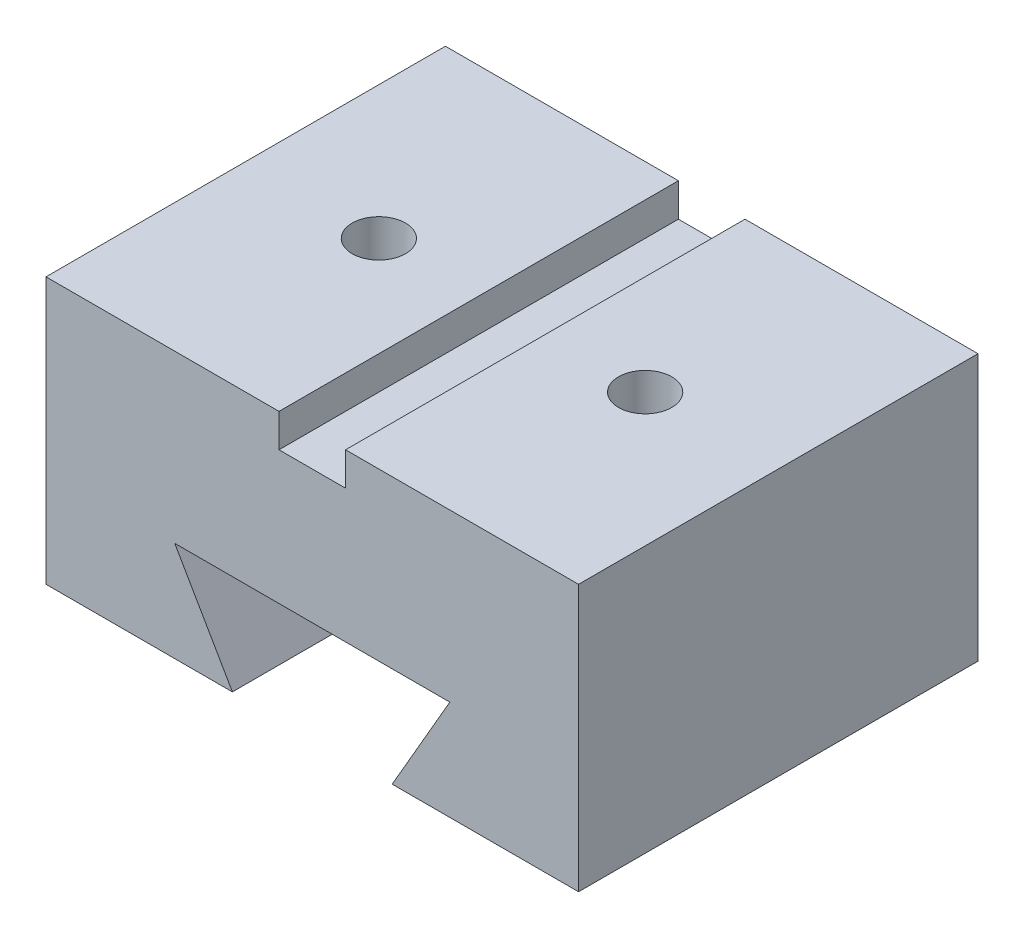
ISO-10303-21;
HEADER;
FILE_DESCRIPTION(('STEP AP214'),'2;1');
FILE_NAME('part.step','',(''),(''),'','','');
FILE_SCHEMA(('AUTOMOTIVE_DESIGN { 1 0 10303 214 1 1 1 1 }'));
ENDSEC;
DATA;
#1=APPLICATION_CONTEXT('core data for automotive mechanical design processes');
#2=APPLICATION_PROTOCOL_DEFINITION('international standard','automotive_design',2000,#1);
#3=PRODUCT_CONTEXT('',#1,'mechanical');
#4=PRODUCT('Part','Part','',(#3));
#5=PRODUCT_RELATED_PRODUCT_CATEGORY('part','',(#4));
#6=PRODUCT_DEFINITION_FORMATION('','',#4);
#7=PRODUCT_DEFINITION_CONTEXT('part definition',#1,'design');
#8=PRODUCT_DEFINITION('design','',#6,#7);
#9=PRODUCT_DEFINITION_SHAPE('','',#8);
#10=(LENGTH_UNIT() NAMED_UNIT(*) SI_UNIT(.MILLI.,.METRE.));
#11=(NAMED_UNIT(*) PLANE_ANGLE_UNIT() SI_UNIT($,.RADIAN.));
#12=(NAMED_UNIT(*) SI_UNIT($,.STERADIAN.) SOLID_ANGLE_UNIT());
#13=UNCERTAINTY_MEASURE_WITH_UNIT(LENGTH_MEASURE(1.E-05),#10,'distance_accuracy_value','');
#14=(GEOMETRIC_REPRESENTATION_CONTEXT(3) GLOBAL_UNCERTAINTY_ASSIGNED_CONTEXT((#13)) GLOBAL_UNIT_ASSIGNED_CONTEXT((#10,
#11,#12)) REPRESENTATION_CONTEXT('',''));
#15=CARTESIAN_POINT('',(0.,0.,0.));
#16=DIRECTION('',(0.,0.,1.));
#17=DIRECTION('',(1.,0.,0.));
#18=AXIS2_PLACEMENT_3D('',#15,#16,#17);
#19=CARTESIAN_POINT('',(0.,40.,0.));
#20=DIRECTION('',(0.,-1.,0.));
#21=DIRECTION('',(0.,0.,-1.));
#22=AXIS2_PLACEMENT_3D('',#19,#20,#21);
#23=PLANE('',#22);
#24=CARTESIAN_POINT('',(-20.,40.,0.));
#25=DIRECTION('',(0.,1.,0.));
#26=DIRECTION('',(0.,0.,1.));
#27=AXIS2_PLACEMENT_3D('',#24,#25,#26);
#28=CIRCLE('',#27,4.);
#29=CARTESIAN_POINT('',(-20.,40.,4.));
#30=VERTEX_POINT('',#29);
#31=EDGE_CURVE('E280',#30,#30,#28,.T.);
#32=ORIENTED_EDGE('',*,*,#31,.F.);
#33=EDGE_LOOP('',(#32));
#34=FACE_BOUND('',#33,.T.);
#35=DIRECTION('',(1.,0.,0.));
#36=VECTOR('',#35,1.);
#37=CARTESIAN_POINT('',(40.,40.,30.));
#38=LINE('',#37,#36);
#39=CARTESIAN_POINT('',(-40.,40.,30.));
#40=VERTEX_POINT('',#39);
#41=CARTESIAN_POINT('',(-5.,40.,30.));
#42=VERTEX_POINT('',#41);
#43=EDGE_CURVE('E99',#40,#42,#38,.T.);
#44=ORIENTED_EDGE('',*,*,#43,.T.);
#45=DIRECTION('',(0.,0.,1.));
#46=VECTOR('',#45,1.);
#47=CARTESIAN_POINT('',(-5.,40.,30.));
#48=LINE('',#47,#46);
#49=CARTESIAN_POINT('',(-5.,40.,-30.));
#50=VERTEX_POINT('',#49);
#51=EDGE_CURVE('E149',#50,#42,#48,.T.);
#52=ORIENTED_EDGE('',*,*,#51,.F.);
#53=DIRECTION('',(-1.,0.,0.));
#54=VECTOR('',#53,1.);
#55=CARTESIAN_POINT('',(-40.,40.,-30.));
#56=LINE('',#55,#54);
#57=CARTESIAN_POINT('',(-40.,40.,-30.));
#58=VERTEX_POINT('',#57);
#59=EDGE_CURVE('E70',#50,#58,#56,.T.);
#60=ORIENTED_EDGE('',*,*,#59,.T.);
#61=DIRECTION('',(0.,0.,1.));
#62=VECTOR('',#61,1.);
#63=CARTESIAN_POINT('',(-40.,40.,30.));
#64=LINE('',#63,#62);
#65=EDGE_CURVE('E223',#58,#40,#64,.T.);
#66=ORIENTED_EDGE('',*,*,#65,.T.);
#67=EDGE_LOOP('',(#44,#52,#60,#66));
#68=FACE_BOUND('',#67,.T.);
#69=ADVANCED_FACE('F45',(#34,#68),#23,.F.);
#70=CARTESIAN_POINT('',(0.,0.,0.));
#71=DIRECTION('',(0.,-1.,0.));
#72=DIRECTION('',(0.,0.,-1.));
#73=AXIS2_PLACEMENT_3D('',#70,#71,#72);
#74=PLANE('',#73);
#75=DIRECTION('',(-1.,0.,0.));
#76=VECTOR('',#75,1.);
#77=CARTESIAN_POINT('',(-40.,0.,-30.));
#78=LINE('',#77,#76);
#79=CARTESIAN_POINT('',(-12.,0.,-30.));
#80=VERTEX_POINT('',#79);
#81=CARTESIAN_POINT('',(-40.,0.,-30.));
#82=VERTEX_POINT('',#81);
#83=EDGE_CURVE('E92',#80,#82,#78,.T.);
#84=ORIENTED_EDGE('',*,*,#83,.F.);
#85=DIRECTION('',(0.,0.,-1.));
#86=VECTOR('',#85,1.);
#87=CARTESIAN_POINT('',(-12.,0.,30.));
#88=LINE('',#87,#86);
#89=CARTESIAN_POINT('',(-12.,0.,30.));
#90=VERTEX_POINT('',#89);
#91=EDGE_CURVE('E219',#90,#80,#88,.T.);
#92=ORIENTED_EDGE('',*,*,#91,.F.);
#93=DIRECTION('',(1.,0.,0.));
#94=VECTOR('',#93,1.);
#95=CARTESIAN_POINT('',(40.,0.,30.));
#96=LINE('',#95,#94);
#97=CARTESIAN_POINT('',(-40.,0.,30.));
#98=VERTEX_POINT('',#97);
#99=EDGE_CURVE('E241',#98,#90,#96,.T.);
#100=ORIENTED_EDGE('',*,*,#99,.F.);
#101=DIRECTION('',(0.,0.,1.));
#102=VECTOR('',#101,1.);
#103=CARTESIAN_POINT('',(-40.,0.,30.));
#104=LINE('',#103,#102);
#105=EDGE_CURVE('E222',#82,#98,#104,.T.);
#106=ORIENTED_EDGE('',*,*,#105,.F.);
#107=EDGE_LOOP('',(#84,#92,#100,#106));
#108=FACE_BOUND('',#107,.T.);
#109=ADVANCED_FACE('F302',(#108),#74,.T.);
#110=CARTESIAN_POINT('',(40.,40.,30.));
#111=DIRECTION('',(0.,0.,-1.));
#112=DIRECTION('',(-1.,0.,0.));
#113=AXIS2_PLACEMENT_3D('',#110,#111,#112);
#114=PLANE('',#113);
#115=DIRECTION('',(1.,0.,0.));
#116=VECTOR('',#115,1.);
#117=CARTESIAN_POINT('',(5.,35.,30.));
#118=LINE('',#117,#116);
#119=CARTESIAN_POINT('',(-5.,35.,30.));
#120=VERTEX_POINT('',#119);
#121=CARTESIAN_POINT('',(5.,35.,30.));
#122=VERTEX_POINT('',#121);
#123=EDGE_CURVE('E158',#120,#122,#118,.T.);
#124=ORIENTED_EDGE('',*,*,#123,.F.);
#125=DIRECTION('',(0.,1.,0.));
#126=VECTOR('',#125,1.);
#127=CARTESIAN_POINT('',(-5.,35.,30.));
#128=LINE('',#127,#126);
#129=EDGE_CURVE('E144',#120,#42,#128,.T.);
#130=ORIENTED_EDGE('',*,*,#129,.T.);
#131=ORIENTED_EDGE('',*,*,#43,.F.);
#132=DIRECTION('',(0.,-1.,0.));
#133=VECTOR('',#132,1.);
#134=CARTESIAN_POINT('',(-40.,40.,30.));
#135=LINE('',#134,#133);
#136=EDGE_CURVE('E11',#40,#98,#135,.T.);
#137=ORIENTED_EDGE('',*,*,#136,.T.);
#138=ORIENTED_EDGE('',*,*,#99,.T.);
#139=DIRECTION('',(0.500001990215758,-0.866024254729786,0.));
#140=VECTOR('',#139,1.);
#141=CARTESIAN_POINT('',(-20.6603,15.,30.));
#142=LINE('',#141,#140);
#143=CARTESIAN_POINT('',(-20.6603,15.,30.));
#144=VERTEX_POINT('',#143);
#145=EDGE_CURVE('E201',#144,#90,#142,.T.);
#146=ORIENTED_EDGE('',*,*,#145,.F.);
#147=DIRECTION('',(-1.,0.,0.));
#148=VECTOR('',#147,1.);
#149=CARTESIAN_POINT('',(20.6603,15.,30.));
#150=LINE('',#149,#148);
#151=CARTESIAN_POINT('',(20.6603,15.,30.));
#152=VERTEX_POINT('',#151);
#153=EDGE_CURVE('E207',#152,#144,#150,.T.);
#154=ORIENTED_EDGE('',*,*,#153,.F.);
#155=DIRECTION('',(0.500001990215758,0.866024254729786,0.));
#156=VECTOR('',#155,1.);
#157=CARTESIAN_POINT('',(12.,0.,30.));
#158=LINE('',#157,#156);
#159=CARTESIAN_POINT('',(12.,0.,30.));
#160=VERTEX_POINT('',#159);
#161=EDGE_CURVE('E204',#160,#152,#158,.T.);
#162=ORIENTED_EDGE('',*,*,#161,.F.);
#163=CARTESIAN_POINT('',(40.,0.,30.));
#164=VERTEX_POINT('',#163);
#165=EDGE_CURVE('E240',#160,#164,#96,.T.);
#166=ORIENTED_EDGE('',*,*,#165,.T.);
#167=DIRECTION('',(0.,-1.,0.));
#168=VECTOR('',#167,1.);
#169=CARTESIAN_POINT('',(40.,40.,30.));
#170=LINE('',#169,#168);
#171=CARTESIAN_POINT('',(40.,40.,30.));
#172=VERTEX_POINT('',#171);
#173=EDGE_CURVE('E54',#172,#164,#170,.T.);
#174=ORIENTED_EDGE('',*,*,#173,.F.);
#175=CARTESIAN_POINT('',(5.,40.,30.));
#176=VERTEX_POINT('',#175);
#177=EDGE_CURVE('E226',#176,#172,#38,.T.);
#178=ORIENTED_EDGE('',*,*,#177,.F.);
#179=DIRECTION('',(0.,1.,0.));
#180=VECTOR('',#179,1.);
#181=CARTESIAN_POINT('',(5.,35.,30.));
#182=LINE('',#181,#180);
#183=EDGE_CURVE('E61',#122,#176,#182,.T.);
#184=ORIENTED_EDGE('',*,*,#183,.F.);
#185=EDGE_LOOP('',(#124,#130,#131,#137,#138,#146,#154,#162,#166,#174,#178,#184));
#186=FACE_BOUND('',#185,.T.);
#187=ADVANCED_FACE('F164',(#186),#114,.F.);
#188=DIRECTION('',(0.,0.,-1.));
#189=VECTOR('',#188,1.);
#190=CARTESIAN_POINT('',(12.,0.,30.));
#191=LINE('',#190,#189);
#192=CARTESIAN_POINT('',(12.,0.,-30.));
#193=VERTEX_POINT('',#192);
#194=EDGE_CURVE('E216',#160,#193,#191,.T.);
#195=ORIENTED_EDGE('',*,*,#194,.T.);
#196=CARTESIAN_POINT('',(40.,0.,-30.));
#197=VERTEX_POINT('',#196);
#198=EDGE_CURVE('E227',#197,#193,#78,.T.);
#199=ORIENTED_EDGE('',*,*,#198,.F.);
#200=DIRECTION('',(0.,0.,-1.));
#201=VECTOR('',#200,1.);
#202=CARTESIAN_POINT('',(40.,0.,-30.));
#203=LINE('',#202,#201);
#204=EDGE_CURVE('E245',#164,#197,#203,.T.);
#205=ORIENTED_EDGE('',*,*,#204,.F.);
#206=ORIENTED_EDGE('',*,*,#165,.F.);
#207=EDGE_LOOP('',(#195,#199,#205,#206));
#208=FACE_BOUND('',#207,.T.);
#209=ADVANCED_FACE('F267',(#208),#74,.T.);
#210=CARTESIAN_POINT('',(-40.,40.,30.));
#211=DIRECTION('',(1.,0.,0.));
#212=DIRECTION('',(0.,0.,-1.));
#213=AXIS2_PLACEMENT_3D('',#210,#211,#212);
#214=PLANE('',#213);
#215=ORIENTED_EDGE('',*,*,#105,.T.);
#216=ORIENTED_EDGE('',*,*,#136,.F.);
#217=ORIENTED_EDGE('',*,*,#65,.F.);
#218=DIRECTION('',(0.,-1.,0.));
#219=VECTOR('',#218,1.);
#220=CARTESIAN_POINT('',(-40.,40.,-30.));
#221=LINE('',#220,#219);
#222=EDGE_CURVE('E236',#58,#82,#221,.T.);
#223=ORIENTED_EDGE('',*,*,#222,.T.);
#224=EDGE_LOOP('',(#215,#216,#217,#223));
#225=FACE_BOUND('',#224,.T.);
#226=ADVANCED_FACE('F47',(#225),#214,.F.);
#227=CARTESIAN_POINT('',(40.,40.,-30.));
#228=DIRECTION('',(-1.,0.,0.));
#229=DIRECTION('',(0.,0.,1.));
#230=AXIS2_PLACEMENT_3D('',#227,#228,#229);
#231=PLANE('',#230);
#232=ORIENTED_EDGE('',*,*,#204,.T.);
#233=DIRECTION('',(0.,-1.,0.));
#234=VECTOR('',#233,1.);
#235=CARTESIAN_POINT('',(40.,40.,-30.));
#236=LINE('',#235,#234);
#237=CARTESIAN_POINT('',(40.,40.,-30.));
#238=VERTEX_POINT('',#237);
#239=EDGE_CURVE('E253',#238,#197,#236,.T.);
#240=ORIENTED_EDGE('',*,*,#239,.F.);
#241=DIRECTION('',(0.,0.,-1.));
#242=VECTOR('',#241,1.);
#243=CARTESIAN_POINT('',(40.,40.,-30.));
#244=LINE('',#243,#242);
#245=EDGE_CURVE('E230',#172,#238,#244,.T.);
#246=ORIENTED_EDGE('',*,*,#245,.F.);
#247=ORIENTED_EDGE('',*,*,#173,.T.);
#248=EDGE_LOOP('',(#232,#240,#246,#247));
#249=FACE_BOUND('',#248,.T.);
#250=ADVANCED_FACE('F262',(#249),#231,.F.);
#251=CARTESIAN_POINT('',(-40.,40.,-30.));
#252=DIRECTION('',(0.,0.,1.));
#253=DIRECTION('',(1.,0.,0.));
#254=AXIS2_PLACEMENT_3D('',#251,#252,#253);
#255=PLANE('',#254);
#256=ORIENTED_EDGE('',*,*,#59,.F.);
#257=DIRECTION('',(0.,1.,0.));
#258=VECTOR('',#257,1.);
#259=CARTESIAN_POINT('',(-5.,35.,-30.));
#260=LINE('',#259,#258);
#261=CARTESIAN_POINT('',(-5.,35.,-30.));
#262=VERTEX_POINT('',#261);
#263=EDGE_CURVE('E182',#262,#50,#260,.T.);
#264=ORIENTED_EDGE('',*,*,#263,.F.);
#265=DIRECTION('',(-1.,0.,0.));
#266=VECTOR('',#265,1.);
#267=CARTESIAN_POINT('',(-5.,35.,-30.));
#268=LINE('',#267,#266);
#269=CARTESIAN_POINT('',(5.,35.,-30.));
#270=VERTEX_POINT('',#269);
#271=EDGE_CURVE('E152',#270,#262,#268,.T.);
#272=ORIENTED_EDGE('',*,*,#271,.F.);
#273=DIRECTION('',(0.,1.,0.));
#274=VECTOR('',#273,1.);
#275=CARTESIAN_POINT('',(5.,35.,-30.));
#276=LINE('',#275,#274);
#277=CARTESIAN_POINT('',(5.,40.,-30.));
#278=VERTEX_POINT('',#277);
#279=EDGE_CURVE('E186',#270,#278,#276,.T.);
#280=ORIENTED_EDGE('',*,*,#279,.T.);
#281=EDGE_CURVE('E233',#238,#278,#56,.T.);
#282=ORIENTED_EDGE('',*,*,#281,.F.);
#283=ORIENTED_EDGE('',*,*,#239,.T.);
#284=ORIENTED_EDGE('',*,*,#198,.T.);
#285=DIRECTION('',(0.500001990215758,0.866024254729786,0.));
#286=VECTOR('',#285,1.);
#287=CARTESIAN_POINT('',(12.,0.,-30.));
#288=LINE('',#287,#286);
#289=CARTESIAN_POINT('',(20.6603,15.,-30.));
#290=VERTEX_POINT('',#289);
#291=EDGE_CURVE('E194',#193,#290,#288,.T.);
#292=ORIENTED_EDGE('',*,*,#291,.T.);
#293=DIRECTION('',(-1.,0.,0.));
#294=VECTOR('',#293,1.);
#295=CARTESIAN_POINT('',(20.6603,15.,-30.));
#296=LINE('',#295,#294);
#297=CARTESIAN_POINT('',(-20.6603,15.,-30.));
#298=VERTEX_POINT('',#297);
#299=EDGE_CURVE('E198',#290,#298,#296,.T.);
#300=ORIENTED_EDGE('',*,*,#299,.T.);
#301=DIRECTION('',(0.500001990215758,-0.866024254729786,0.));
#302=VECTOR('',#301,1.);
#303=CARTESIAN_POINT('',(-20.6603,15.,-30.));
#304=LINE('',#303,#302);
#305=EDGE_CURVE('E185',#298,#80,#304,.T.);
#306=ORIENTED_EDGE('',*,*,#305,.T.);
#307=ORIENTED_EDGE('',*,*,#83,.T.);
#308=ORIENTED_EDGE('',*,*,#222,.F.);
#309=EDGE_LOOP('',(#256,#264,#272,#280,#282,#283,#284,#292,#300,#306,#307,#308));
#310=FACE_BOUND('',#309,.T.);
#311=ADVANCED_FACE('F269',(#310),#255,.F.);
#312=CARTESIAN_POINT('',(20.,40.,0.));
#313=DIRECTION('',(0.,1.,0.));
#314=DIRECTION('',(0.,0.,1.));
#315=AXIS2_PLACEMENT_3D('',#312,#313,#314);
#316=CIRCLE('',#315,4.);
#317=CARTESIAN_POINT('',(20.,40.,4.));
#318=VERTEX_POINT('',#317);
#319=EDGE_CURVE('E278',#318,#318,#316,.T.);
#320=ORIENTED_EDGE('',*,*,#319,.F.);
#321=EDGE_LOOP('',(#320));
#322=FACE_BOUND('',#321,.T.);
#323=ORIENTED_EDGE('',*,*,#281,.T.);
#324=DIRECTION('',(0.,0.,-1.));
#325=VECTOR('',#324,1.);
#326=CARTESIAN_POINT('',(5.,40.,-30.));
#327=LINE('',#326,#325);
#328=EDGE_CURVE('E162',#176,#278,#327,.T.);
#329=ORIENTED_EDGE('',*,*,#328,.F.);
#330=ORIENTED_EDGE('',*,*,#177,.T.);
#331=ORIENTED_EDGE('',*,*,#245,.T.);
#332=EDGE_LOOP('',(#323,#329,#330,#331));
#333=FACE_BOUND('',#332,.T.);
#334=ADVANCED_FACE('F272',(#322,#333),#23,.F.);
#335=CARTESIAN_POINT('',(-20.6603,15.,30.));
#336=DIRECTION('',(0.866024254729786,0.500001990215758,0.));
#337=DIRECTION('',(-0.500001990215758,0.866024254729786,0.));
#338=AXIS2_PLACEMENT_3D('',#335,#336,#337);
#339=PLANE('',#338);
#340=ORIENTED_EDGE('',*,*,#91,.T.);
#341=ORIENTED_EDGE('',*,*,#305,.F.);
#342=DIRECTION('',(0.,0.,-1.));
#343=VECTOR('',#342,1.);
#344=CARTESIAN_POINT('',(-20.6603,15.,30.));
#345=LINE('',#344,#343);
#346=EDGE_CURVE('E210',#144,#298,#345,.T.);
#347=ORIENTED_EDGE('',*,*,#346,.F.);
#348=ORIENTED_EDGE('',*,*,#145,.T.);
#349=EDGE_LOOP('',(#340,#341,#347,#348));
#350=FACE_BOUND('',#349,.T.);
#351=ADVANCED_FACE('F316',(#350),#339,.T.);
#352=CARTESIAN_POINT('',(12.,0.,30.));
#353=DIRECTION('',(-0.866024254729786,0.500001990215758,0.));
#354=DIRECTION('',(-0.500001990215758,-0.866024254729786,0.));
#355=AXIS2_PLACEMENT_3D('',#352,#353,#354);
#356=PLANE('',#355);
#357=DIRECTION('',(0.,0.,-1.));
#358=VECTOR('',#357,1.);
#359=CARTESIAN_POINT('',(20.6603,15.,30.));
#360=LINE('',#359,#358);
#361=EDGE_CURVE('E213',#152,#290,#360,.T.);
#362=ORIENTED_EDGE('',*,*,#361,.T.);
#363=ORIENTED_EDGE('',*,*,#291,.F.);
#364=ORIENTED_EDGE('',*,*,#194,.F.);
#365=ORIENTED_EDGE('',*,*,#161,.T.);
#366=EDGE_LOOP('',(#362,#363,#364,#365));
#367=FACE_BOUND('',#366,.T.);
#368=ADVANCED_FACE('F292',(#367),#356,.T.);
#369=CARTESIAN_POINT('',(20.6603,15.,30.));
#370=DIRECTION('',(0.,-1.,0.));
#371=DIRECTION('',(0.,0.,-1.));
#372=AXIS2_PLACEMENT_3D('',#369,#370,#371);
#373=PLANE('',#372);
#374=ORIENTED_EDGE('',*,*,#346,.T.);
#375=ORIENTED_EDGE('',*,*,#299,.F.);
#376=ORIENTED_EDGE('',*,*,#361,.F.);
#377=ORIENTED_EDGE('',*,*,#153,.T.);
#378=EDGE_LOOP('',(#374,#375,#376,#377));
#379=FACE_BOUND('',#378,.T.);
#380=ADVANCED_FACE('F295',(#379),#373,.T.);
#381=CARTESIAN_POINT('',(-5.,35.,30.));
#382=DIRECTION('',(-1.,0.,0.));
#383=DIRECTION('',(0.,0.,1.));
#384=AXIS2_PLACEMENT_3D('',#381,#382,#383);
#385=PLANE('',#384);
#386=ORIENTED_EDGE('',*,*,#51,.T.);
#387=ORIENTED_EDGE('',*,*,#129,.F.);
#388=DIRECTION('',(0.,0.,1.));
#389=VECTOR('',#388,1.);
#390=CARTESIAN_POINT('',(-5.,35.,30.));
#391=LINE('',#390,#389);
#392=EDGE_CURVE('E147',#262,#120,#391,.T.);
#393=ORIENTED_EDGE('',*,*,#392,.F.);
#394=ORIENTED_EDGE('',*,*,#263,.T.);
#395=EDGE_LOOP('',(#386,#387,#393,#394));
#396=FACE_BOUND('',#395,.T.);
#397=ADVANCED_FACE('F146',(#396),#385,.F.);
#398=CARTESIAN_POINT('',(5.,35.,-30.));
#399=DIRECTION('',(1.,0.,0.));
#400=DIRECTION('',(0.,0.,-1.));
#401=AXIS2_PLACEMENT_3D('',#398,#399,#400);
#402=PLANE('',#401);
#403=ORIENTED_EDGE('',*,*,#328,.T.);
#404=ORIENTED_EDGE('',*,*,#279,.F.);
#405=DIRECTION('',(0.,0.,-1.));
#406=VECTOR('',#405,1.);
#407=CARTESIAN_POINT('',(5.,35.,-30.));
#408=LINE('',#407,#406);
#409=EDGE_CURVE('E167',#122,#270,#408,.T.);
#410=ORIENTED_EDGE('',*,*,#409,.F.);
#411=ORIENTED_EDGE('',*,*,#183,.T.);
#412=EDGE_LOOP('',(#403,#404,#410,#411));
#413=FACE_BOUND('',#412,.T.);
#414=ADVANCED_FACE('F335',(#413),#402,.F.);
#415=CARTESIAN_POINT('',(0.,35.,0.));
#416=DIRECTION('',(0.,-1.,0.));
#417=DIRECTION('',(0.,0.,-1.));
#418=AXIS2_PLACEMENT_3D('',#415,#416,#417);
#419=PLANE('',#418);
#420=ORIENTED_EDGE('',*,*,#392,.T.);
#421=ORIENTED_EDGE('',*,*,#123,.T.);
#422=ORIENTED_EDGE('',*,*,#409,.T.);
#423=ORIENTED_EDGE('',*,*,#271,.T.);
#424=EDGE_LOOP('',(#420,#421,#422,#423));
#425=FACE_BOUND('',#424,.T.);
#426=ADVANCED_FACE('F156',(#425),#419,.F.);
#427=CARTESIAN_POINT('',(20.,28.,0.));
#428=DIRECTION('',(0.,1.,0.));
#429=DIRECTION('',(0.,0.,1.));
#430=AXIS2_PLACEMENT_3D('',#427,#428,#429);
#431=CYLINDRICAL_SURFACE('',#430,4.);
#432=CARTESIAN_POINT('',(20.,28.,0.));
#433=DIRECTION('',(0.,1.,0.));
#434=DIRECTION('',(0.,0.,1.));
#435=AXIS2_PLACEMENT_3D('',#432,#433,#434);
#436=CIRCLE('',#435,4.);
#437=CARTESIAN_POINT('',(20.,28.,4.));
#438=VERTEX_POINT('',#437);
#439=EDGE_CURVE('E275',#438,#438,#436,.T.);
#440=ORIENTED_EDGE('',*,*,#439,.F.);
#441=EDGE_LOOP('',(#440));
#442=FACE_BOUND('',#441,.T.);
#443=ORIENTED_EDGE('',*,*,#319,.T.);
#444=EDGE_LOOP('',(#443));
#445=FACE_BOUND('',#444,.T.);
#446=ADVANCED_FACE('F324',(#442,#445),#431,.F.);
#447=CARTESIAN_POINT('',(20.,28.,0.));
#448=DIRECTION('',(0.,1.,0.));
#449=DIRECTION('',(0.,0.,1.));
#450=AXIS2_PLACEMENT_3D('',#447,#448,#449);
#451=PLANE('',#450);
#452=ORIENTED_EDGE('',*,*,#439,.T.);
#453=EDGE_LOOP('',(#452));
#454=FACE_BOUND('',#453,.T.);
#455=ADVANCED_FACE('F326',(#454),#451,.T.);
#456=CARTESIAN_POINT('',(-20.,28.,0.));
#457=DIRECTION('',(0.,1.,0.));
#458=DIRECTION('',(0.,0.,1.));
#459=AXIS2_PLACEMENT_3D('',#456,#457,#458);
#460=CYLINDRICAL_SURFACE('',#459,4.);
#461=CARTESIAN_POINT('',(-20.,28.,0.));
#462=DIRECTION('',(0.,1.,0.));
#463=DIRECTION('',(0.,0.,1.));
#464=AXIS2_PLACEMENT_3D('',#461,#462,#463);
#465=CIRCLE('',#464,4.);
#466=CARTESIAN_POINT('',(-20.,28.,4.));
#467=VERTEX_POINT('',#466);
#468=EDGE_CURVE('E179',#467,#467,#465,.T.);
#469=ORIENTED_EDGE('',*,*,#468,.F.);
#470=EDGE_LOOP('',(#469));
#471=FACE_BOUND('',#470,.T.);
#472=ORIENTED_EDGE('',*,*,#31,.T.);
#473=EDGE_LOOP('',(#472));
#474=FACE_BOUND('',#473,.T.);
#475=ADVANCED_FACE('F332',(#471,#474),#460,.F.);
#476=CARTESIAN_POINT('',(-20.,28.,0.));
#477=DIRECTION('',(0.,1.,0.));
#478=DIRECTION('',(0.,0.,1.));
#479=AXIS2_PLACEMENT_3D('',#476,#477,#478);
#480=PLANE('',#479);
#481=ORIENTED_EDGE('',*,*,#468,.T.);
#482=EDGE_LOOP('',(#481));
#483=FACE_BOUND('',#482,.T.);
#484=ADVANCED_FACE('F398',(#483),#480,.T.);
#485=CLOSED_SHELL('',(#69,#109,#187,#209,#226,#250,#311,#334,#351,#368,#380,#397,#414,#426,#446,
#455,#475,#484));
#486=MANIFOLD_SOLID_BREP('B2',#485);
#487=ADVANCED_BREP_SHAPE_REPRESENTATION('',(#18,#486),#14);
#488=SHAPE_DEFINITION_REPRESENTATION(#9,#487);
ENDSEC;
END-ISO-10303-21;
